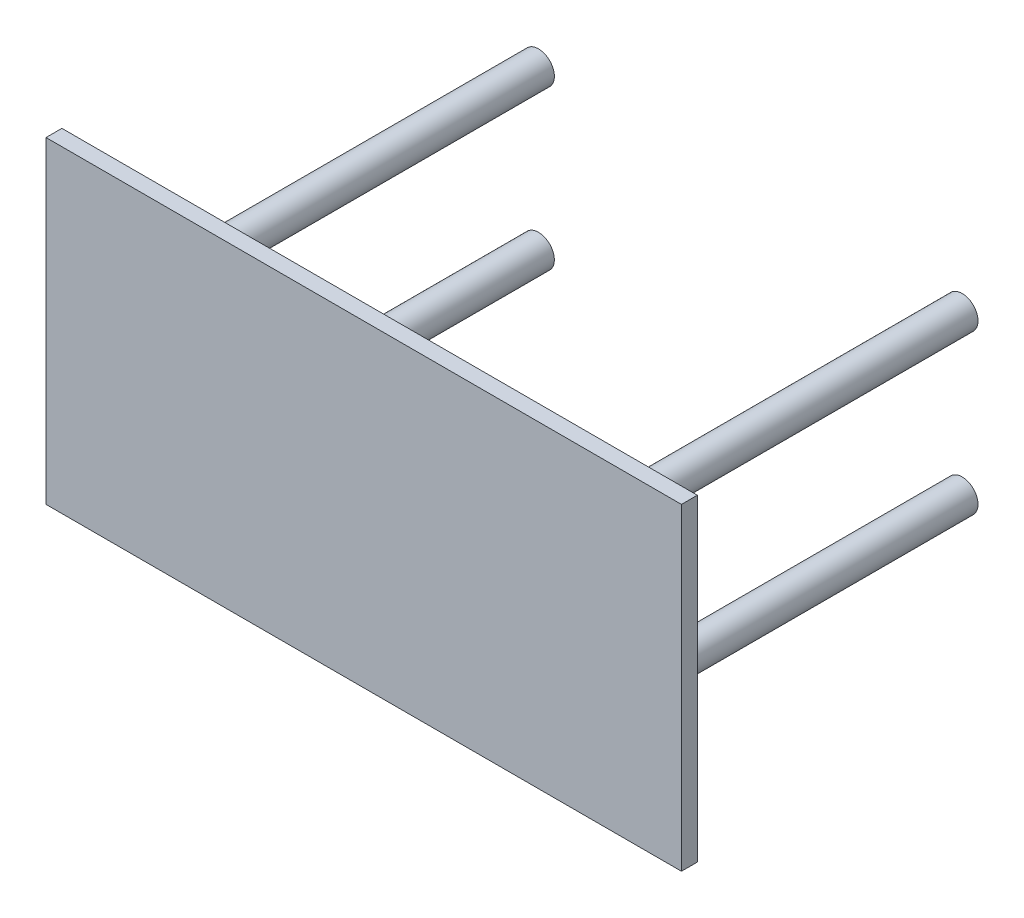
ISO-10303-21;
HEADER;
FILE_DESCRIPTION(('STEP AP214'),'2;1');
FILE_NAME('part.step','',(''),(''),'','','');
FILE_SCHEMA(('AUTOMOTIVE_DESIGN { 1 0 10303 214 1 1 1 1 }'));
ENDSEC;
DATA;
#1=APPLICATION_CONTEXT('core data for automotive mechanical design processes');
#2=APPLICATION_PROTOCOL_DEFINITION('international standard','automotive_design',2000,#1);
#3=PRODUCT_CONTEXT('',#1,'mechanical');
#4=PRODUCT('Part','Part','',(#3));
#5=PRODUCT_RELATED_PRODUCT_CATEGORY('part','',(#4));
#6=PRODUCT_DEFINITION_FORMATION('','',#4);
#7=PRODUCT_DEFINITION_CONTEXT('part definition',#1,'design');
#8=PRODUCT_DEFINITION('design','',#6,#7);
#9=PRODUCT_DEFINITION_SHAPE('','',#8);
#10=(LENGTH_UNIT() NAMED_UNIT(*) SI_UNIT(.MILLI.,.METRE.));
#11=(NAMED_UNIT(*) PLANE_ANGLE_UNIT() SI_UNIT($,.RADIAN.));
#12=(NAMED_UNIT(*) SI_UNIT($,.STERADIAN.) SOLID_ANGLE_UNIT());
#13=UNCERTAINTY_MEASURE_WITH_UNIT(LENGTH_MEASURE(1.E-05),#10,'distance_accuracy_value','');
#14=(GEOMETRIC_REPRESENTATION_CONTEXT(3) GLOBAL_UNCERTAINTY_ASSIGNED_CONTEXT((#13)) GLOBAL_UNIT_ASSIGNED_CONTEXT((#10,
#11,#12)) REPRESENTATION_CONTEXT('',''));
#15=CARTESIAN_POINT('',(0.,0.,0.));
#16=DIRECTION('',(0.,0.,1.));
#17=DIRECTION('',(1.,0.,0.));
#18=AXIS2_PLACEMENT_3D('',#15,#16,#17);
#19=CARTESIAN_POINT('',(60.,-30.,3.));
#20=DIRECTION('',(-1.,0.,0.));
#21=DIRECTION('',(0.,0.,1.));
#22=AXIS2_PLACEMENT_3D('',#19,#20,#21);
#23=PLANE('',#22);
#24=DIRECTION('',(0.,1.,0.));
#25=VECTOR('',#24,1.);
#26=CARTESIAN_POINT('',(60.,-30.,0.));
#27=LINE('',#26,#25);
#28=CARTESIAN_POINT('',(60.,-30.,0.));
#29=VERTEX_POINT('',#28);
#30=CARTESIAN_POINT('',(60.,30.,0.));
#31=VERTEX_POINT('',#30);
#32=EDGE_CURVE('E107',#29,#31,#27,.T.);
#33=ORIENTED_EDGE('',*,*,#32,.T.);
#34=DIRECTION('',(0.,0.,-1.));
#35=VECTOR('',#34,1.);
#36=CARTESIAN_POINT('',(60.,30.,3.));
#37=LINE('',#36,#35);
#38=CARTESIAN_POINT('',(60.,30.,3.));
#39=VERTEX_POINT('',#38);
#40=EDGE_CURVE('E11',#39,#31,#37,.T.);
#41=ORIENTED_EDGE('',*,*,#40,.F.);
#42=DIRECTION('',(0.,1.,0.));
#43=VECTOR('',#42,1.);
#44=CARTESIAN_POINT('',(60.,-30.,3.));
#45=LINE('',#44,#43);
#46=CARTESIAN_POINT('',(60.,-30.,3.));
#47=VERTEX_POINT('',#46);
#48=EDGE_CURVE('E91',#47,#39,#45,.T.);
#49=ORIENTED_EDGE('',*,*,#48,.F.);
#50=DIRECTION('',(0.,0.,-1.));
#51=VECTOR('',#50,1.);
#52=CARTESIAN_POINT('',(60.,-30.,3.));
#53=LINE('',#52,#51);
#54=EDGE_CURVE('E103',#47,#29,#53,.T.);
#55=ORIENTED_EDGE('',*,*,#54,.T.);
#56=EDGE_LOOP('',(#33,#41,#49,#55));
#57=FACE_BOUND('',#56,.T.);
#58=ADVANCED_FACE('F39',(#57),#23,.F.);
#59=CARTESIAN_POINT('',(-60.,30.,3.));
#60=DIRECTION('',(0.,-1.,0.));
#61=DIRECTION('',(0.,0.,-1.));
#62=AXIS2_PLACEMENT_3D('',#59,#60,#61);
#63=PLANE('',#62);
#64=DIRECTION('',(-1.,0.,0.));
#65=VECTOR('',#64,1.);
#66=CARTESIAN_POINT('',(-60.,30.,0.));
#67=LINE('',#66,#65);
#68=CARTESIAN_POINT('',(-60.,30.,0.));
#69=VERTEX_POINT('',#68);
#70=EDGE_CURVE('E96',#31,#69,#67,.T.);
#71=ORIENTED_EDGE('',*,*,#70,.T.);
#72=DIRECTION('',(0.,0.,-1.));
#73=VECTOR('',#72,1.);
#74=CARTESIAN_POINT('',(-60.,30.,3.));
#75=LINE('',#74,#73);
#76=CARTESIAN_POINT('',(-60.,30.,3.));
#77=VERTEX_POINT('',#76);
#78=EDGE_CURVE('E48',#77,#69,#75,.T.);
#79=ORIENTED_EDGE('',*,*,#78,.F.);
#80=DIRECTION('',(-1.,0.,0.));
#81=VECTOR('',#80,1.);
#82=CARTESIAN_POINT('',(-60.,30.,3.));
#83=LINE('',#82,#81);
#84=EDGE_CURVE('E86',#39,#77,#83,.T.);
#85=ORIENTED_EDGE('',*,*,#84,.F.);
#86=ORIENTED_EDGE('',*,*,#40,.T.);
#87=EDGE_LOOP('',(#71,#79,#85,#86));
#88=FACE_BOUND('',#87,.T.);
#89=ADVANCED_FACE('F95',(#88),#63,.F.);
#90=CARTESIAN_POINT('',(-60.,-30.,3.));
#91=DIRECTION('',(1.,0.,0.));
#92=DIRECTION('',(0.,0.,-1.));
#93=AXIS2_PLACEMENT_3D('',#90,#91,#92);
#94=PLANE('',#93);
#95=DIRECTION('',(0.,-1.,0.));
#96=VECTOR('',#95,1.);
#97=CARTESIAN_POINT('',(-60.,-30.,0.));
#98=LINE('',#97,#96);
#99=CARTESIAN_POINT('',(-60.,-30.,0.));
#100=VERTEX_POINT('',#99);
#101=EDGE_CURVE('E73',#69,#100,#98,.T.);
#102=ORIENTED_EDGE('',*,*,#101,.T.);
#103=DIRECTION('',(0.,0.,-1.));
#104=VECTOR('',#103,1.);
#105=CARTESIAN_POINT('',(-60.,-30.,3.));
#106=LINE('',#105,#104);
#107=CARTESIAN_POINT('',(-60.,-30.,3.));
#108=VERTEX_POINT('',#107);
#109=EDGE_CURVE('E98',#108,#100,#106,.T.);
#110=ORIENTED_EDGE('',*,*,#109,.F.);
#111=DIRECTION('',(0.,-1.,0.));
#112=VECTOR('',#111,1.);
#113=CARTESIAN_POINT('',(-60.,-30.,3.));
#114=LINE('',#113,#112);
#115=EDGE_CURVE('E89',#77,#108,#114,.T.);
#116=ORIENTED_EDGE('',*,*,#115,.F.);
#117=ORIENTED_EDGE('',*,*,#78,.T.);
#118=EDGE_LOOP('',(#102,#110,#116,#117));
#119=FACE_BOUND('',#118,.T.);
#120=ADVANCED_FACE('F99',(#119),#94,.F.);
#121=CARTESIAN_POINT('',(-60.,-30.,3.));
#122=DIRECTION('',(0.,1.,0.));
#123=DIRECTION('',(0.,0.,1.));
#124=AXIS2_PLACEMENT_3D('',#121,#122,#123);
#125=PLANE('',#124);
#126=DIRECTION('',(1.,0.,0.));
#127=VECTOR('',#126,1.);
#128=CARTESIAN_POINT('',(-60.,-30.,0.));
#129=LINE('',#128,#127);
#130=EDGE_CURVE('E79',#100,#29,#129,.T.);
#131=ORIENTED_EDGE('',*,*,#130,.T.);
#132=ORIENTED_EDGE('',*,*,#54,.F.);
#133=DIRECTION('',(1.,0.,0.));
#134=VECTOR('',#133,1.);
#135=CARTESIAN_POINT('',(-60.,-30.,3.));
#136=LINE('',#135,#134);
#137=EDGE_CURVE('E56',#108,#47,#136,.T.);
#138=ORIENTED_EDGE('',*,*,#137,.F.);
#139=ORIENTED_EDGE('',*,*,#109,.T.);
#140=EDGE_LOOP('',(#131,#132,#138,#139));
#141=FACE_BOUND('',#140,.T.);
#142=ADVANCED_FACE('F121',(#141),#125,.F.);
#143=CARTESIAN_POINT('',(0.,0.,3.));
#144=DIRECTION('',(0.,0.,-1.));
#145=DIRECTION('',(-1.,0.,0.));
#146=AXIS2_PLACEMENT_3D('',#143,#144,#145);
#147=PLANE('',#146);
#148=ORIENTED_EDGE('',*,*,#48,.T.);
#149=ORIENTED_EDGE('',*,*,#84,.T.);
#150=ORIENTED_EDGE('',*,*,#115,.T.);
#151=ORIENTED_EDGE('',*,*,#137,.T.);
#152=EDGE_LOOP('',(#148,#149,#150,#151));
#153=FACE_BOUND('',#152,.T.);
#154=ADVANCED_FACE('F87',(#153),#147,.F.);
#155=CARTESIAN_POINT('',(0.,0.,0.));
#156=DIRECTION('',(0.,0.,-1.));
#157=DIRECTION('',(-1.,0.,0.));
#158=AXIS2_PLACEMENT_3D('',#155,#156,#157);
#159=PLANE('',#158);
#160=CARTESIAN_POINT('',(40.,-15.,0.));
#161=DIRECTION('',(0.,0.,-1.));
#162=DIRECTION('',(1.,0.,0.));
#163=AXIS2_PLACEMENT_3D('',#160,#161,#162);
#164=CIRCLE('',#163,3.);
#165=CARTESIAN_POINT('',(43.,-15.,0.));
#166=VERTEX_POINT('',#165);
#167=EDGE_CURVE('E152',#166,#166,#164,.T.);
#168=ORIENTED_EDGE('',*,*,#167,.F.);
#169=EDGE_LOOP('',(#168));
#170=FACE_BOUND('',#169,.T.);
#171=CARTESIAN_POINT('',(-40.,-15.,0.));
#172=DIRECTION('',(0.,0.,-1.));
#173=DIRECTION('',(-1.,0.,0.));
#174=AXIS2_PLACEMENT_3D('',#171,#172,#173);
#175=CIRCLE('',#174,3.);
#176=CARTESIAN_POINT('',(-43.,-15.,0.));
#177=VERTEX_POINT('',#176);
#178=EDGE_CURVE('E144',#177,#177,#175,.T.);
#179=ORIENTED_EDGE('',*,*,#178,.F.);
#180=EDGE_LOOP('',(#179));
#181=FACE_BOUND('',#180,.T.);
#182=CARTESIAN_POINT('',(-40.,15.,0.));
#183=DIRECTION('',(0.,0.,-1.));
#184=DIRECTION('',(1.,0.,0.));
#185=AXIS2_PLACEMENT_3D('',#182,#183,#184);
#186=CIRCLE('',#185,3.);
#187=CARTESIAN_POINT('',(-37.,15.,0.));
#188=VERTEX_POINT('',#187);
#189=EDGE_CURVE('E136',#188,#188,#186,.T.);
#190=ORIENTED_EDGE('',*,*,#189,.F.);
#191=EDGE_LOOP('',(#190));
#192=FACE_BOUND('',#191,.T.);
#193=CARTESIAN_POINT('',(40.,15.,0.));
#194=DIRECTION('',(0.,0.,-1.));
#195=DIRECTION('',(-1.,0.,0.));
#196=AXIS2_PLACEMENT_3D('',#193,#194,#195);
#197=CIRCLE('',#196,3.);
#198=CARTESIAN_POINT('',(37.,15.,0.));
#199=VERTEX_POINT('',#198);
#200=EDGE_CURVE('E128',#199,#199,#197,.T.);
#201=ORIENTED_EDGE('',*,*,#200,.F.);
#202=EDGE_LOOP('',(#201));
#203=FACE_BOUND('',#202,.T.);
#204=ORIENTED_EDGE('',*,*,#32,.F.);
#205=ORIENTED_EDGE('',*,*,#130,.F.);
#206=ORIENTED_EDGE('',*,*,#101,.F.);
#207=ORIENTED_EDGE('',*,*,#70,.F.);
#208=EDGE_LOOP('',(#204,#205,#206,#207));
#209=FACE_BOUND('',#208,.T.);
#210=ADVANCED_FACE('F124',(#170,#181,#192,#203,#209),#159,.T.);
#211=CARTESIAN_POINT('',(40.,15.,-70.));
#212=DIRECTION('',(0.,0.,1.));
#213=DIRECTION('',(1.,0.,0.));
#214=AXIS2_PLACEMENT_3D('',#211,#212,#213);
#215=CYLINDRICAL_SURFACE('',#214,3.);
#216=CARTESIAN_POINT('',(40.,15.,-70.));
#217=DIRECTION('',(0.,0.,-1.));
#218=DIRECTION('',(-1.,0.,0.));
#219=AXIS2_PLACEMENT_3D('',#216,#217,#218);
#220=CIRCLE('',#219,3.);
#221=CARTESIAN_POINT('',(37.,15.,-70.));
#222=VERTEX_POINT('',#221);
#223=EDGE_CURVE('E111',#222,#222,#220,.T.);
#224=ORIENTED_EDGE('',*,*,#223,.F.);
#225=EDGE_LOOP('',(#224));
#226=FACE_BOUND('',#225,.T.);
#227=ORIENTED_EDGE('',*,*,#200,.T.);
#228=EDGE_LOOP('',(#227));
#229=FACE_BOUND('',#228,.T.);
#230=ADVANCED_FACE('F171',(#226,#229),#215,.T.);
#231=CARTESIAN_POINT('',(40.,15.,-70.));
#232=DIRECTION('',(0.,0.,-1.));
#233=DIRECTION('',(-1.,0.,0.));
#234=AXIS2_PLACEMENT_3D('',#231,#232,#233);
#235=PLANE('',#234);
#236=ORIENTED_EDGE('',*,*,#223,.T.);
#237=EDGE_LOOP('',(#236));
#238=FACE_BOUND('',#237,.T.);
#239=ADVANCED_FACE('F180',(#238),#235,.T.);
#240=CARTESIAN_POINT('',(-40.,15.,-70.));
#241=DIRECTION('',(0.,0.,1.));
#242=DIRECTION('',(1.,0.,0.));
#243=AXIS2_PLACEMENT_3D('',#240,#241,#242);
#244=CYLINDRICAL_SURFACE('',#243,3.);
#245=CARTESIAN_POINT('',(-40.,15.,-70.));
#246=DIRECTION('',(0.,0.,-1.));
#247=DIRECTION('',(1.,0.,0.));
#248=AXIS2_PLACEMENT_3D('',#245,#246,#247);
#249=CIRCLE('',#248,3.);
#250=CARTESIAN_POINT('',(-37.,15.,-70.));
#251=VERTEX_POINT('',#250);
#252=EDGE_CURVE('E132',#251,#251,#249,.T.);
#253=ORIENTED_EDGE('',*,*,#252,.F.);
#254=EDGE_LOOP('',(#253));
#255=FACE_BOUND('',#254,.T.);
#256=ORIENTED_EDGE('',*,*,#189,.T.);
#257=EDGE_LOOP('',(#256));
#258=FACE_BOUND('',#257,.T.);
#259=ADVANCED_FACE('F186',(#255,#258),#244,.T.);
#260=CARTESIAN_POINT('',(-40.,15.,-70.));
#261=DIRECTION('',(0.,0.,1.));
#262=DIRECTION('',(1.,0.,0.));
#263=AXIS2_PLACEMENT_3D('',#260,#261,#262);
#264=PLANE('',#263);
#265=ORIENTED_EDGE('',*,*,#252,.T.);
#266=EDGE_LOOP('',(#265));
#267=FACE_BOUND('',#266,.T.);
#268=ADVANCED_FACE('F229',(#267),#264,.F.);
#269=CARTESIAN_POINT('',(-40.,-15.,-70.));
#270=DIRECTION('',(0.,0.,1.));
#271=DIRECTION('',(1.,0.,0.));
#272=AXIS2_PLACEMENT_3D('',#269,#270,#271);
#273=CYLINDRICAL_SURFACE('',#272,3.);
#274=CARTESIAN_POINT('',(-40.,-15.,-70.));
#275=DIRECTION('',(0.,0.,-1.));
#276=DIRECTION('',(-1.,0.,0.));
#277=AXIS2_PLACEMENT_3D('',#274,#275,#276);
#278=CIRCLE('',#277,3.);
#279=CARTESIAN_POINT('',(-43.,-15.,-70.));
#280=VERTEX_POINT('',#279);
#281=EDGE_CURVE('E140',#280,#280,#278,.T.);
#282=ORIENTED_EDGE('',*,*,#281,.F.);
#283=EDGE_LOOP('',(#282));
#284=FACE_BOUND('',#283,.T.);
#285=ORIENTED_EDGE('',*,*,#178,.T.);
#286=EDGE_LOOP('',(#285));
#287=FACE_BOUND('',#286,.T.);
#288=ADVANCED_FACE('F239',(#284,#287),#273,.T.);
#289=CARTESIAN_POINT('',(-40.,-15.,-70.));
#290=DIRECTION('',(0.,0.,-1.));
#291=DIRECTION('',(-1.,0.,0.));
#292=AXIS2_PLACEMENT_3D('',#289,#290,#291);
#293=PLANE('',#292);
#294=ORIENTED_EDGE('',*,*,#281,.T.);
#295=EDGE_LOOP('',(#294));
#296=FACE_BOUND('',#295,.T.);
#297=ADVANCED_FACE('F165',(#296),#293,.T.);
#298=CARTESIAN_POINT('',(40.,-15.,-70.));
#299=DIRECTION('',(0.,0.,1.));
#300=DIRECTION('',(1.,0.,0.));
#301=AXIS2_PLACEMENT_3D('',#298,#299,#300);
#302=CYLINDRICAL_SURFACE('',#301,3.);
#303=CARTESIAN_POINT('',(40.,-15.,-70.));
#304=DIRECTION('',(0.,0.,-1.));
#305=DIRECTION('',(1.,0.,0.));
#306=AXIS2_PLACEMENT_3D('',#303,#304,#305);
#307=CIRCLE('',#306,3.);
#308=CARTESIAN_POINT('',(43.,-15.,-70.));
#309=VERTEX_POINT('',#308);
#310=EDGE_CURVE('E148',#309,#309,#307,.T.);
#311=ORIENTED_EDGE('',*,*,#310,.F.);
#312=EDGE_LOOP('',(#311));
#313=FACE_BOUND('',#312,.T.);
#314=ORIENTED_EDGE('',*,*,#167,.T.);
#315=EDGE_LOOP('',(#314));
#316=FACE_BOUND('',#315,.T.);
#317=ADVANCED_FACE('F162',(#313,#316),#302,.T.);
#318=CARTESIAN_POINT('',(40.,-15.,-70.));
#319=DIRECTION('',(0.,0.,1.));
#320=DIRECTION('',(1.,0.,0.));
#321=AXIS2_PLACEMENT_3D('',#318,#319,#320);
#322=PLANE('',#321);
#323=ORIENTED_EDGE('',*,*,#310,.T.);
#324=EDGE_LOOP('',(#323));
#325=FACE_BOUND('',#324,.T.);
#326=ADVANCED_FACE('F160',(#325),#322,.F.);
#327=CLOSED_SHELL('',(#58,#89,#120,#142,#154,#210,#230,#239,#259,#268,#288,#297,#317,#326));
#328=MANIFOLD_SOLID_BREP('B2',#327);
#329=ADVANCED_BREP_SHAPE_REPRESENTATION('',(#18,#328),#14);
#330=SHAPE_DEFINITION_REPRESENTATION(#9,#329);
ENDSEC;
END-ISO-10303-21;
